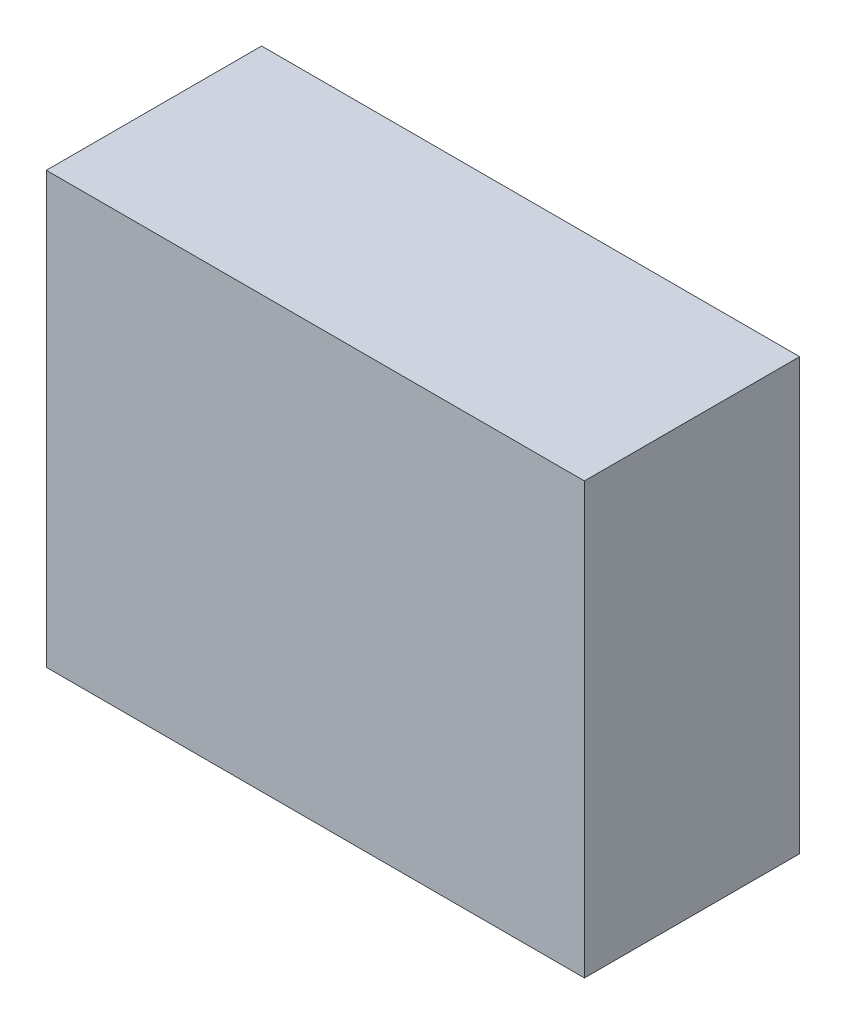
ISO-10303-21;
HEADER;
FILE_DESCRIPTION(('STEP AP214'),'2;1');
FILE_NAME('part.step','',(''),(''),'','','');
FILE_SCHEMA(('AUTOMOTIVE_DESIGN { 1 0 10303 214 1 1 1 1 }'));
ENDSEC;
DATA;
#1=APPLICATION_CONTEXT('core data for automotive mechanical design processes');
#2=APPLICATION_PROTOCOL_DEFINITION('international standard','automotive_design',2000,#1);
#3=PRODUCT_CONTEXT('',#1,'mechanical');
#4=PRODUCT('Part','Part','',(#3));
#5=PRODUCT_RELATED_PRODUCT_CATEGORY('part','',(#4));
#6=PRODUCT_DEFINITION_FORMATION('','',#4);
#7=PRODUCT_DEFINITION_CONTEXT('part definition',#1,'design');
#8=PRODUCT_DEFINITION('design','',#6,#7);
#9=PRODUCT_DEFINITION_SHAPE('','',#8);
#10=(LENGTH_UNIT() NAMED_UNIT(*) SI_UNIT(.MILLI.,.METRE.));
#11=(NAMED_UNIT(*) PLANE_ANGLE_UNIT() SI_UNIT($,.RADIAN.));
#12=(NAMED_UNIT(*) SI_UNIT($,.STERADIAN.) SOLID_ANGLE_UNIT());
#13=UNCERTAINTY_MEASURE_WITH_UNIT(LENGTH_MEASURE(1.E-05),#10,'distance_accuracy_value','');
#14=(GEOMETRIC_REPRESENTATION_CONTEXT(3) GLOBAL_UNCERTAINTY_ASSIGNED_CONTEXT((#13)) GLOBAL_UNIT_ASSIGNED_CONTEXT((#10,
#11,#12)) REPRESENTATION_CONTEXT('',''));
#15=CARTESIAN_POINT('',(0.,0.,0.));
#16=DIRECTION('',(0.,0.,1.));
#17=DIRECTION('',(1.,0.,0.));
#18=AXIS2_PLACEMENT_3D('',#15,#16,#17);
#19=CARTESIAN_POINT('',(-25.,-20.,20.));
#20=DIRECTION('',(1.,0.,0.));
#21=DIRECTION('',(0.,0.,-1.));
#22=AXIS2_PLACEMENT_3D('',#19,#20,#21);
#23=PLANE('',#22);
#24=DIRECTION('',(0.,-1.,0.));
#25=VECTOR('',#24,1.);
#26=CARTESIAN_POINT('',(-25.,-20.,0.));
#27=LINE('',#26,#25);
#28=CARTESIAN_POINT('',(-25.,20.,0.));
#29=VERTEX_POINT('',#28);
#30=CARTESIAN_POINT('',(-25.,-20.,0.));
#31=VERTEX_POINT('',#30);
#32=EDGE_CURVE('E104',#29,#31,#27,.T.);
#33=ORIENTED_EDGE('',*,*,#32,.T.);
#34=DIRECTION('',(0.,0.,-1.));
#35=VECTOR('',#34,1.);
#36=CARTESIAN_POINT('',(-25.,-20.,20.));
#37=LINE('',#36,#35);
#38=CARTESIAN_POINT('',(-25.,-20.,20.));
#39=VERTEX_POINT('',#38);
#40=EDGE_CURVE('E11',#39,#31,#37,.T.);
#41=ORIENTED_EDGE('',*,*,#40,.F.);
#42=DIRECTION('',(0.,-1.,0.));
#43=VECTOR('',#42,1.);
#44=CARTESIAN_POINT('',(-25.,-20.,20.));
#45=LINE('',#44,#43);
#46=CARTESIAN_POINT('',(-25.,20.,20.));
#47=VERTEX_POINT('',#46);
#48=EDGE_CURVE('E92',#47,#39,#45,.T.);
#49=ORIENTED_EDGE('',*,*,#48,.F.);
#50=DIRECTION('',(0.,0.,-1.));
#51=VECTOR('',#50,1.);
#52=CARTESIAN_POINT('',(-25.,20.,20.));
#53=LINE('',#52,#51);
#54=EDGE_CURVE('E100',#47,#29,#53,.T.);
#55=ORIENTED_EDGE('',*,*,#54,.T.);
#56=EDGE_LOOP('',(#33,#41,#49,#55));
#57=FACE_BOUND('',#56,.T.);
#58=ADVANCED_FACE('F41',(#57),#23,.F.);
#59=CARTESIAN_POINT('',(-25.,-20.,20.));
#60=DIRECTION('',(0.,1.,0.));
#61=DIRECTION('',(0.,0.,1.));
#62=AXIS2_PLACEMENT_3D('',#59,#60,#61);
#63=PLANE('',#62);
#64=DIRECTION('',(1.,0.,0.));
#65=VECTOR('',#64,1.);
#66=CARTESIAN_POINT('',(-25.,-20.,0.));
#67=LINE('',#66,#65);
#68=CARTESIAN_POINT('',(25.,-20.,0.));
#69=VERTEX_POINT('',#68);
#70=EDGE_CURVE('E96',#31,#69,#67,.T.);
#71=ORIENTED_EDGE('',*,*,#70,.T.);
#72=DIRECTION('',(0.,0.,-1.));
#73=VECTOR('',#72,1.);
#74=CARTESIAN_POINT('',(25.,-20.,20.));
#75=LINE('',#74,#73);
#76=CARTESIAN_POINT('',(25.,-20.,20.));
#77=VERTEX_POINT('',#76);
#78=EDGE_CURVE('E49',#77,#69,#75,.T.);
#79=ORIENTED_EDGE('',*,*,#78,.F.);
#80=DIRECTION('',(1.,0.,0.));
#81=VECTOR('',#80,1.);
#82=CARTESIAN_POINT('',(-25.,-20.,20.));
#83=LINE('',#82,#81);
#84=EDGE_CURVE('E87',#39,#77,#83,.T.);
#85=ORIENTED_EDGE('',*,*,#84,.F.);
#86=ORIENTED_EDGE('',*,*,#40,.T.);
#87=EDGE_LOOP('',(#71,#79,#85,#86));
#88=FACE_BOUND('',#87,.T.);
#89=ADVANCED_FACE('F95',(#88),#63,.F.);
#90=CARTESIAN_POINT('',(25.,-20.,20.));
#91=DIRECTION('',(-1.,0.,0.));
#92=DIRECTION('',(0.,0.,1.));
#93=AXIS2_PLACEMENT_3D('',#90,#91,#92);
#94=PLANE('',#93);
#95=DIRECTION('',(0.,1.,0.));
#96=VECTOR('',#95,1.);
#97=CARTESIAN_POINT('',(25.,-20.,0.));
#98=LINE('',#97,#96);
#99=CARTESIAN_POINT('',(25.,20.,0.));
#100=VERTEX_POINT('',#99);
#101=EDGE_CURVE('E74',#69,#100,#98,.T.);
#102=ORIENTED_EDGE('',*,*,#101,.T.);
#103=DIRECTION('',(0.,0.,-1.));
#104=VECTOR('',#103,1.);
#105=CARTESIAN_POINT('',(25.,20.,20.));
#106=LINE('',#105,#104);
#107=CARTESIAN_POINT('',(25.,20.,20.));
#108=VERTEX_POINT('',#107);
#109=EDGE_CURVE('E97',#108,#100,#106,.T.);
#110=ORIENTED_EDGE('',*,*,#109,.F.);
#111=DIRECTION('',(0.,1.,0.));
#112=VECTOR('',#111,1.);
#113=CARTESIAN_POINT('',(25.,-20.,20.));
#114=LINE('',#113,#112);
#115=EDGE_CURVE('E90',#77,#108,#114,.T.);
#116=ORIENTED_EDGE('',*,*,#115,.F.);
#117=ORIENTED_EDGE('',*,*,#78,.T.);
#118=EDGE_LOOP('',(#102,#110,#116,#117));
#119=FACE_BOUND('',#118,.T.);
#120=ADVANCED_FACE('F98',(#119),#94,.F.);
#121=CARTESIAN_POINT('',(-25.,20.,20.));
#122=DIRECTION('',(0.,-1.,0.));
#123=DIRECTION('',(0.,0.,-1.));
#124=AXIS2_PLACEMENT_3D('',#121,#122,#123);
#125=PLANE('',#124);
#126=DIRECTION('',(-1.,0.,0.));
#127=VECTOR('',#126,1.);
#128=CARTESIAN_POINT('',(-25.,20.,0.));
#129=LINE('',#128,#127);
#130=EDGE_CURVE('E80',#100,#29,#129,.T.);
#131=ORIENTED_EDGE('',*,*,#130,.T.);
#132=ORIENTED_EDGE('',*,*,#54,.F.);
#133=DIRECTION('',(-1.,0.,0.));
#134=VECTOR('',#133,1.);
#135=CARTESIAN_POINT('',(-25.,20.,20.));
#136=LINE('',#135,#134);
#137=EDGE_CURVE('E57',#108,#47,#136,.T.);
#138=ORIENTED_EDGE('',*,*,#137,.F.);
#139=ORIENTED_EDGE('',*,*,#109,.T.);
#140=EDGE_LOOP('',(#131,#132,#138,#139));
#141=FACE_BOUND('',#140,.T.);
#142=ADVANCED_FACE('F111',(#141),#125,.F.);
#143=CARTESIAN_POINT('',(0.,0.,20.));
#144=DIRECTION('',(0.,0.,-1.));
#145=DIRECTION('',(-1.,0.,0.));
#146=AXIS2_PLACEMENT_3D('',#143,#144,#145);
#147=PLANE('',#146);
#148=ORIENTED_EDGE('',*,*,#48,.T.);
#149=ORIENTED_EDGE('',*,*,#84,.T.);
#150=ORIENTED_EDGE('',*,*,#115,.T.);
#151=ORIENTED_EDGE('',*,*,#137,.T.);
#152=EDGE_LOOP('',(#148,#149,#150,#151));
#153=FACE_BOUND('',#152,.T.);
#154=ADVANCED_FACE('F88',(#153),#147,.F.);
#155=CARTESIAN_POINT('',(0.,0.,0.));
#156=DIRECTION('',(0.,0.,-1.));
#157=DIRECTION('',(-1.,0.,0.));
#158=AXIS2_PLACEMENT_3D('',#155,#156,#157);
#159=PLANE('',#158);
#160=ORIENTED_EDGE('',*,*,#32,.F.);
#161=ORIENTED_EDGE('',*,*,#130,.F.);
#162=ORIENTED_EDGE('',*,*,#101,.F.);
#163=ORIENTED_EDGE('',*,*,#70,.F.);
#164=EDGE_LOOP('',(#160,#161,#162,#163));
#165=FACE_BOUND('',#164,.T.);
#166=ADVANCED_FACE('F114',(#165),#159,.T.);
#167=CLOSED_SHELL('',(#58,#89,#120,#142,#154,#166));
#168=MANIFOLD_SOLID_BREP('B2',#167);
#169=ADVANCED_BREP_SHAPE_REPRESENTATION('',(#18,#168),#14);
#170=SHAPE_DEFINITION_REPRESENTATION(#9,#169);
ENDSEC;
END-ISO-10303-21;
